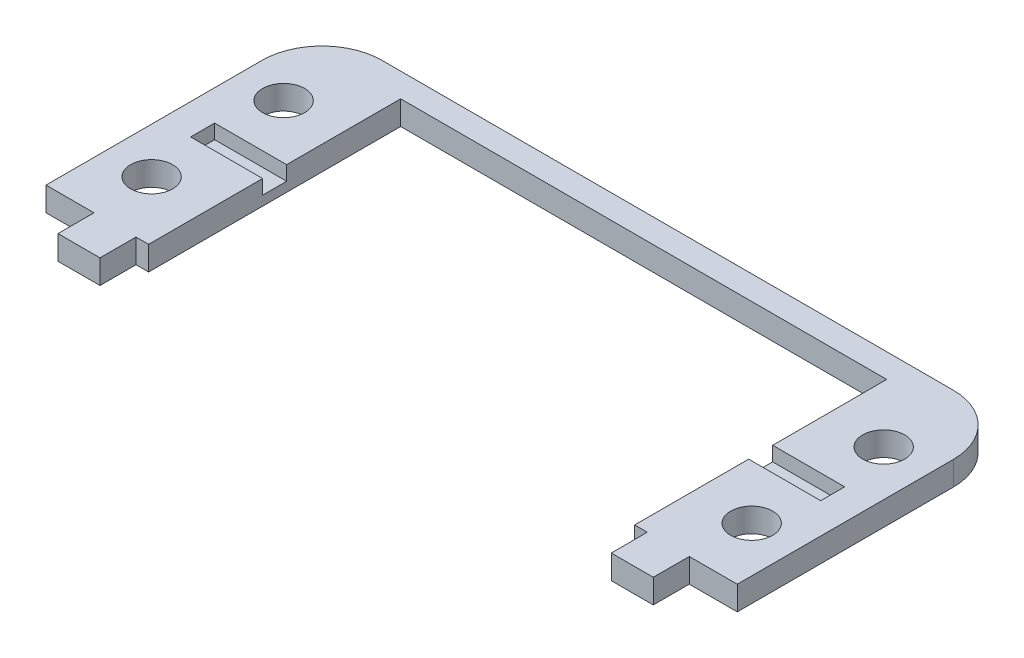
ISO-10303-21;
HEADER;
FILE_DESCRIPTION(('STEP AP214'),'2;1');
FILE_NAME('part.step','',(''),(''),'','','');
FILE_SCHEMA(('AUTOMOTIVE_DESIGN { 1 0 10303 214 1 1 1 1 }'));
ENDSEC;
DATA;
#1=APPLICATION_CONTEXT('core data for automotive mechanical design processes');
#2=APPLICATION_PROTOCOL_DEFINITION('international standard','automotive_design',2000,#1);
#3=PRODUCT_CONTEXT('',#1,'mechanical');
#4=PRODUCT('Part','Part','',(#3));
#5=PRODUCT_RELATED_PRODUCT_CATEGORY('part','',(#4));
#6=PRODUCT_DEFINITION_FORMATION('','',#4);
#7=PRODUCT_DEFINITION_CONTEXT('part definition',#1,'design');
#8=PRODUCT_DEFINITION('design','',#6,#7);
#9=PRODUCT_DEFINITION_SHAPE('','',#8);
#10=(LENGTH_UNIT() NAMED_UNIT(*) SI_UNIT(.MILLI.,.METRE.));
#11=(NAMED_UNIT(*) PLANE_ANGLE_UNIT() SI_UNIT($,.RADIAN.));
#12=(NAMED_UNIT(*) SI_UNIT($,.STERADIAN.) SOLID_ANGLE_UNIT());
#13=UNCERTAINTY_MEASURE_WITH_UNIT(LENGTH_MEASURE(1.E-05),#10,'distance_accuracy_value','');
#14=(GEOMETRIC_REPRESENTATION_CONTEXT(3) GLOBAL_UNCERTAINTY_ASSIGNED_CONTEXT((#13)) GLOBAL_UNIT_ASSIGNED_CONTEXT((#10,
#11,#12)) REPRESENTATION_CONTEXT('',''));
#15=CARTESIAN_POINT('',(0.,0.,0.));
#16=DIRECTION('',(0.,0.,1.));
#17=DIRECTION('',(1.,0.,0.));
#18=AXIS2_PLACEMENT_3D('',#15,#16,#17);
#19=CARTESIAN_POINT('',(28.8,2.,0.));
#20=DIRECTION('',(1.,0.,0.));
#21=DIRECTION('',(0.,0.,-1.));
#22=AXIS2_PLACEMENT_3D('',#19,#20,#21);
#23=PLANE('',#22);
#24=DIRECTION('',(0.,0.,1.));
#25=VECTOR('',#24,1.);
#26=CARTESIAN_POINT('',(28.8,0.,0.));
#27=LINE('',#26,#25);
#28=CARTESIAN_POINT('',(28.8,0.,-18.));
#29=VERTEX_POINT('',#28);
#30=CARTESIAN_POINT('',(28.8,0.,0.));
#31=VERTEX_POINT('',#30);
#32=EDGE_CURVE('E263',#29,#31,#27,.T.);
#33=ORIENTED_EDGE('',*,*,#32,.F.);
#34=DIRECTION('',(0.,-1.,0.));
#35=VECTOR('',#34,1.);
#36=CARTESIAN_POINT('',(28.8,2.,-18.));
#37=LINE('',#36,#35);
#38=CARTESIAN_POINT('',(28.8,2.,-18.));
#39=VERTEX_POINT('',#38);
#40=EDGE_CURVE('E11',#39,#29,#37,.T.);
#41=ORIENTED_EDGE('',*,*,#40,.F.);
#42=DIRECTION('',(0.,0.,1.));
#43=VECTOR('',#42,1.);
#44=CARTESIAN_POINT('',(28.8,2.,0.));
#45=LINE('',#44,#43);
#46=CARTESIAN_POINT('',(28.8,2.,0.));
#47=VERTEX_POINT('',#46);
#48=EDGE_CURVE('E269',#39,#47,#45,.T.);
#49=ORIENTED_EDGE('',*,*,#48,.T.);
#50=DIRECTION('',(0.,-1.,0.));
#51=VECTOR('',#50,1.);
#52=CARTESIAN_POINT('',(28.8,2.,0.));
#53=LINE('',#52,#51);
#54=EDGE_CURVE('E331',#47,#31,#53,.T.);
#55=ORIENTED_EDGE('',*,*,#54,.T.);
#56=EDGE_LOOP('',(#33,#41,#49,#55));
#57=FACE_BOUND('',#56,.T.);
#58=ADVANCED_FACE('F34',(#57),#23,.T.);
#59=CARTESIAN_POINT('',(23.8,2.,-18.));
#60=DIRECTION('',(0.,-1.,0.));
#61=DIRECTION('',(0.,0.,-1.));
#62=AXIS2_PLACEMENT_3D('',#59,#60,#61);
#63=CYLINDRICAL_SURFACE('',#62,5.);
#64=CARTESIAN_POINT('',(23.8,0.,-18.));
#65=DIRECTION('',(0.,1.,0.));
#66=DIRECTION('',(0.,0.,1.));
#67=AXIS2_PLACEMENT_3D('',#64,#65,#66);
#68=CIRCLE('',#67,5.);
#69=CARTESIAN_POINT('',(23.8,0.,-23.));
#70=VERTEX_POINT('',#69);
#71=EDGE_CURVE('E334',#29,#70,#68,.T.);
#72=ORIENTED_EDGE('',*,*,#71,.T.);
#73=DIRECTION('',(0.,-1.,0.));
#74=VECTOR('',#73,1.);
#75=CARTESIAN_POINT('',(23.8,2.,-23.));
#76=LINE('',#75,#74);
#77=CARTESIAN_POINT('',(23.8,2.,-23.));
#78=VERTEX_POINT('',#77);
#79=EDGE_CURVE('E41',#78,#70,#76,.T.);
#80=ORIENTED_EDGE('',*,*,#79,.F.);
#81=CARTESIAN_POINT('',(23.8,2.,-18.));
#82=DIRECTION('',(0.,1.,0.));
#83=DIRECTION('',(0.,0.,1.));
#84=AXIS2_PLACEMENT_3D('',#81,#82,#83);
#85=CIRCLE('',#84,5.);
#86=EDGE_CURVE('E272',#39,#78,#85,.T.);
#87=ORIENTED_EDGE('',*,*,#86,.F.);
#88=ORIENTED_EDGE('',*,*,#40,.T.);
#89=EDGE_LOOP('',(#72,#80,#87,#88));
#90=FACE_BOUND('',#89,.T.);
#91=ADVANCED_FACE('F434',(#90),#63,.T.);
#92=CARTESIAN_POINT('',(0.,2.,-23.));
#93=DIRECTION('',(0.,0.,-1.));
#94=DIRECTION('',(-1.,0.,0.));
#95=AXIS2_PLACEMENT_3D('',#92,#93,#94);
#96=PLANE('',#95);
#97=DIRECTION('',(1.,0.,0.));
#98=VECTOR('',#97,1.);
#99=CARTESIAN_POINT('',(0.,0.,-23.));
#100=LINE('',#99,#98);
#101=CARTESIAN_POINT('',(-23.8,0.,-23.));
#102=VERTEX_POINT('',#101);
#103=EDGE_CURVE('E337',#102,#70,#100,.T.);
#104=ORIENTED_EDGE('',*,*,#103,.F.);
#105=DIRECTION('',(0.,-1.,0.));
#106=VECTOR('',#105,1.);
#107=CARTESIAN_POINT('',(-23.8,2.,-23.));
#108=LINE('',#107,#106);
#109=CARTESIAN_POINT('',(-23.8,2.,-23.));
#110=VERTEX_POINT('',#109);
#111=EDGE_CURVE('E425',#110,#102,#108,.T.);
#112=ORIENTED_EDGE('',*,*,#111,.F.);
#113=DIRECTION('',(1.,0.,0.));
#114=VECTOR('',#113,1.);
#115=CARTESIAN_POINT('',(0.,2.,-23.));
#116=LINE('',#115,#114);
#117=EDGE_CURVE('E275',#110,#78,#116,.T.);
#118=ORIENTED_EDGE('',*,*,#117,.T.);
#119=ORIENTED_EDGE('',*,*,#79,.T.);
#120=EDGE_LOOP('',(#104,#112,#118,#119));
#121=FACE_BOUND('',#120,.T.);
#122=ADVANCED_FACE('F429',(#121),#96,.T.);
#123=CARTESIAN_POINT('',(-23.8,2.,-18.));
#124=DIRECTION('',(0.,-1.,0.));
#125=DIRECTION('',(0.,0.,-1.));
#126=AXIS2_PLACEMENT_3D('',#123,#124,#125);
#127=CYLINDRICAL_SURFACE('',#126,5.);
#128=CARTESIAN_POINT('',(-23.8,0.,-18.));
#129=DIRECTION('',(0.,1.,0.));
#130=DIRECTION('',(0.,0.,1.));
#131=AXIS2_PLACEMENT_3D('',#128,#129,#130);
#132=CIRCLE('',#131,5.);
#133=CARTESIAN_POINT('',(-28.8,0.,-18.));
#134=VERTEX_POINT('',#133);
#135=EDGE_CURVE('E340',#134,#102,#132,.F.);
#136=ORIENTED_EDGE('',*,*,#135,.F.);
#137=DIRECTION('',(0.,-1.,0.));
#138=VECTOR('',#137,1.);
#139=CARTESIAN_POINT('',(-28.8,2.,-18.));
#140=LINE('',#139,#138);
#141=CARTESIAN_POINT('',(-28.8,2.,-18.));
#142=VERTEX_POINT('',#141);
#143=EDGE_CURVE('E423',#142,#134,#140,.T.);
#144=ORIENTED_EDGE('',*,*,#143,.F.);
#145=CARTESIAN_POINT('',(-23.8,2.,-18.));
#146=DIRECTION('',(0.,1.,0.));
#147=DIRECTION('',(0.,0.,1.));
#148=AXIS2_PLACEMENT_3D('',#145,#146,#147);
#149=CIRCLE('',#148,5.);
#150=EDGE_CURVE('E278',#142,#110,#149,.F.);
#151=ORIENTED_EDGE('',*,*,#150,.T.);
#152=ORIENTED_EDGE('',*,*,#111,.T.);
#153=EDGE_LOOP('',(#136,#144,#151,#152));
#154=FACE_BOUND('',#153,.T.);
#155=ADVANCED_FACE('F443',(#154),#127,.T.);
#156=CARTESIAN_POINT('',(-28.8,2.,0.));
#157=DIRECTION('',(-1.,0.,0.));
#158=DIRECTION('',(0.,0.,1.));
#159=AXIS2_PLACEMENT_3D('',#156,#157,#158);
#160=PLANE('',#159);
#161=DIRECTION('',(0.,0.,-1.));
#162=VECTOR('',#161,1.);
#163=CARTESIAN_POINT('',(-28.8,0.,0.));
#164=LINE('',#163,#162);
#165=CARTESIAN_POINT('',(-28.8,0.,0.));
#166=VERTEX_POINT('',#165);
#167=EDGE_CURVE('E343',#166,#134,#164,.T.);
#168=ORIENTED_EDGE('',*,*,#167,.F.);
#169=DIRECTION('',(0.,-1.,0.));
#170=VECTOR('',#169,1.);
#171=CARTESIAN_POINT('',(-28.8,2.,0.));
#172=LINE('',#171,#170);
#173=CARTESIAN_POINT('',(-28.8,2.,0.));
#174=VERTEX_POINT('',#173);
#175=EDGE_CURVE('E421',#174,#166,#172,.T.);
#176=ORIENTED_EDGE('',*,*,#175,.F.);
#177=DIRECTION('',(0.,0.,-1.));
#178=VECTOR('',#177,1.);
#179=CARTESIAN_POINT('',(-28.8,2.,0.));
#180=LINE('',#179,#178);
#181=EDGE_CURVE('E281',#174,#142,#180,.T.);
#182=ORIENTED_EDGE('',*,*,#181,.T.);
#183=ORIENTED_EDGE('',*,*,#143,.T.);
#184=EDGE_LOOP('',(#168,#176,#182,#183));
#185=FACE_BOUND('',#184,.T.);
#186=ADVANCED_FACE('F514',(#185),#160,.T.);
#187=CARTESIAN_POINT('',(0.,2.,0.));
#188=DIRECTION('',(0.,0.,-1.));
#189=DIRECTION('',(-1.,0.,0.));
#190=AXIS2_PLACEMENT_3D('',#187,#188,#189);
#191=PLANE('',#190);
#192=DIRECTION('',(1.,0.,0.));
#193=VECTOR('',#192,1.);
#194=CARTESIAN_POINT('',(0.,0.,0.));
#195=LINE('',#194,#193);
#196=CARTESIAN_POINT('',(-24.8,0.,0.));
#197=VERTEX_POINT('',#196);
#198=EDGE_CURVE('E346',#166,#197,#195,.T.);
#199=ORIENTED_EDGE('',*,*,#198,.T.);
#200=DIRECTION('',(0.,-1.,0.));
#201=VECTOR('',#200,1.);
#202=CARTESIAN_POINT('',(-24.8,2.,0.));
#203=LINE('',#202,#201);
#204=CARTESIAN_POINT('',(-24.8,2.,0.));
#205=VERTEX_POINT('',#204);
#206=EDGE_CURVE('E418',#205,#197,#203,.T.);
#207=ORIENTED_EDGE('',*,*,#206,.F.);
#208=DIRECTION('',(1.,0.,0.));
#209=VECTOR('',#208,1.);
#210=CARTESIAN_POINT('',(0.,2.,0.));
#211=LINE('',#210,#209);
#212=EDGE_CURVE('E284',#174,#205,#211,.T.);
#213=ORIENTED_EDGE('',*,*,#212,.F.);
#214=ORIENTED_EDGE('',*,*,#175,.T.);
#215=EDGE_LOOP('',(#199,#207,#213,#214));
#216=FACE_BOUND('',#215,.T.);
#217=ADVANCED_FACE('F512',(#216),#191,.F.);
#218=CARTESIAN_POINT('',(-24.8,2.,0.));
#219=DIRECTION('',(1.,0.,0.));
#220=DIRECTION('',(0.,0.,-1.));
#221=AXIS2_PLACEMENT_3D('',#218,#219,#220);
#222=PLANE('',#221);
#223=DIRECTION('',(0.,0.,1.));
#224=VECTOR('',#223,1.);
#225=CARTESIAN_POINT('',(-24.8,0.,0.));
#226=LINE('',#225,#224);
#227=CARTESIAN_POINT('',(-24.8,0.,3.));
#228=VERTEX_POINT('',#227);
#229=EDGE_CURVE('E348',#197,#228,#226,.T.);
#230=ORIENTED_EDGE('',*,*,#229,.T.);
#231=DIRECTION('',(0.,-1.,0.));
#232=VECTOR('',#231,1.);
#233=CARTESIAN_POINT('',(-24.8,2.,3.));
#234=LINE('',#233,#232);
#235=CARTESIAN_POINT('',(-24.8,2.,3.));
#236=VERTEX_POINT('',#235);
#237=EDGE_CURVE('E415',#236,#228,#234,.T.);
#238=ORIENTED_EDGE('',*,*,#237,.F.);
#239=DIRECTION('',(0.,0.,1.));
#240=VECTOR('',#239,1.);
#241=CARTESIAN_POINT('',(-24.8,2.,0.));
#242=LINE('',#241,#240);
#243=EDGE_CURVE('E286',#205,#236,#242,.T.);
#244=ORIENTED_EDGE('',*,*,#243,.F.);
#245=ORIENTED_EDGE('',*,*,#206,.T.);
#246=EDGE_LOOP('',(#230,#238,#244,#245));
#247=FACE_BOUND('',#246,.T.);
#248=ADVANCED_FACE('F507',(#247),#222,.F.);
#249=CARTESIAN_POINT('',(0.,2.,3.));
#250=DIRECTION('',(0.,0.,-1.));
#251=DIRECTION('',(-1.,0.,0.));
#252=AXIS2_PLACEMENT_3D('',#249,#250,#251);
#253=PLANE('',#252);
#254=DIRECTION('',(1.,0.,0.));
#255=VECTOR('',#254,1.);
#256=CARTESIAN_POINT('',(0.,0.,3.));
#257=LINE('',#256,#255);
#258=CARTESIAN_POINT('',(-21.3,0.,3.));
#259=VERTEX_POINT('',#258);
#260=EDGE_CURVE('E350',#228,#259,#257,.T.);
#261=ORIENTED_EDGE('',*,*,#260,.T.);
#262=DIRECTION('',(0.,-1.,0.));
#263=VECTOR('',#262,1.);
#264=CARTESIAN_POINT('',(-21.3,2.,3.));
#265=LINE('',#264,#263);
#266=CARTESIAN_POINT('',(-21.3,2.,3.));
#267=VERTEX_POINT('',#266);
#268=EDGE_CURVE('E412',#267,#259,#265,.T.);
#269=ORIENTED_EDGE('',*,*,#268,.F.);
#270=DIRECTION('',(1.,0.,0.));
#271=VECTOR('',#270,1.);
#272=CARTESIAN_POINT('',(0.,2.,3.));
#273=LINE('',#272,#271);
#274=EDGE_CURVE('E288',#236,#267,#273,.T.);
#275=ORIENTED_EDGE('',*,*,#274,.F.);
#276=ORIENTED_EDGE('',*,*,#237,.T.);
#277=EDGE_LOOP('',(#261,#269,#275,#276));
#278=FACE_BOUND('',#277,.T.);
#279=ADVANCED_FACE('F503',(#278),#253,.F.);
#280=CARTESIAN_POINT('',(-21.3,2.,0.));
#281=DIRECTION('',(-1.,0.,0.));
#282=DIRECTION('',(0.,0.,1.));
#283=AXIS2_PLACEMENT_3D('',#280,#281,#282);
#284=PLANE('',#283);
#285=DIRECTION('',(0.,0.,-1.));
#286=VECTOR('',#285,1.);
#287=CARTESIAN_POINT('',(-21.3,0.,0.));
#288=LINE('',#287,#286);
#289=CARTESIAN_POINT('',(-21.3,0.,0.));
#290=VERTEX_POINT('',#289);
#291=EDGE_CURVE('E352',#259,#290,#288,.T.);
#292=ORIENTED_EDGE('',*,*,#291,.T.);
#293=DIRECTION('',(0.,-1.,0.));
#294=VECTOR('',#293,1.);
#295=CARTESIAN_POINT('',(-21.3,2.,0.));
#296=LINE('',#295,#294);
#297=CARTESIAN_POINT('',(-21.3,2.,0.));
#298=VERTEX_POINT('',#297);
#299=EDGE_CURVE('E409',#298,#290,#296,.T.);
#300=ORIENTED_EDGE('',*,*,#299,.F.);
#301=DIRECTION('',(0.,0.,-1.));
#302=VECTOR('',#301,1.);
#303=CARTESIAN_POINT('',(-21.3,2.,0.));
#304=LINE('',#303,#302);
#305=EDGE_CURVE('E290',#267,#298,#304,.T.);
#306=ORIENTED_EDGE('',*,*,#305,.F.);
#307=ORIENTED_EDGE('',*,*,#268,.T.);
#308=EDGE_LOOP('',(#292,#300,#306,#307));
#309=FACE_BOUND('',#308,.T.);
#310=ADVANCED_FACE('F499',(#309),#284,.F.);
#311=CARTESIAN_POINT('',(0.,2.,0.));
#312=DIRECTION('',(0.,0.,-1.));
#313=DIRECTION('',(-1.,0.,0.));
#314=AXIS2_PLACEMENT_3D('',#311,#312,#313);
#315=PLANE('',#314);
#316=DIRECTION('',(1.,0.,0.));
#317=VECTOR('',#316,1.);
#318=CARTESIAN_POINT('',(0.,0.,0.));
#319=LINE('',#318,#317);
#320=CARTESIAN_POINT('',(-20.25,0.,0.));
#321=VERTEX_POINT('',#320);
#322=EDGE_CURVE('E354',#290,#321,#319,.T.);
#323=ORIENTED_EDGE('',*,*,#322,.T.);
#324=DIRECTION('',(0.,-1.,0.));
#325=VECTOR('',#324,1.);
#326=CARTESIAN_POINT('',(-20.25,2.,0.));
#327=LINE('',#326,#325);
#328=CARTESIAN_POINT('',(-20.25,2.,0.));
#329=VERTEX_POINT('',#328);
#330=EDGE_CURVE('E406',#329,#321,#327,.T.);
#331=ORIENTED_EDGE('',*,*,#330,.F.);
#332=DIRECTION('',(1.,0.,0.));
#333=VECTOR('',#332,1.);
#334=CARTESIAN_POINT('',(0.,2.,0.));
#335=LINE('',#334,#333);
#336=EDGE_CURVE('E292',#298,#329,#335,.T.);
#337=ORIENTED_EDGE('',*,*,#336,.F.);
#338=ORIENTED_EDGE('',*,*,#299,.T.);
#339=EDGE_LOOP('',(#323,#331,#337,#338));
#340=FACE_BOUND('',#339,.T.);
#341=ADVANCED_FACE('F494',(#340),#315,.F.);
#342=CARTESIAN_POINT('',(-20.25,2.,0.));
#343=DIRECTION('',(-1.,0.,0.));
#344=DIRECTION('',(0.,0.,1.));
#345=AXIS2_PLACEMENT_3D('',#342,#343,#344);
#346=PLANE('',#345);
#347=DIRECTION('',(0.,0.,-1.));
#348=VECTOR('',#347,1.);
#349=CARTESIAN_POINT('',(-20.25,0.8,-9.5));
#350=LINE('',#349,#348);
#351=CARTESIAN_POINT('',(-20.25,0.8,-9.5));
#352=VERTEX_POINT('',#351);
#353=CARTESIAN_POINT('',(-20.25,0.8,-11.5));
#354=VERTEX_POINT('',#353);
#355=EDGE_CURVE('E242',#352,#354,#350,.T.);
#356=ORIENTED_EDGE('',*,*,#355,.F.);
#357=DIRECTION('',(0.,1.,0.));
#358=VECTOR('',#357,1.);
#359=CARTESIAN_POINT('',(-20.25,0.8,-9.5));
#360=LINE('',#359,#358);
#361=CARTESIAN_POINT('',(-20.25,2.,-9.5));
#362=VERTEX_POINT('',#361);
#363=EDGE_CURVE('E260',#352,#362,#360,.T.);
#364=ORIENTED_EDGE('',*,*,#363,.T.);
#365=DIRECTION('',(0.,0.,-1.));
#366=VECTOR('',#365,1.);
#367=CARTESIAN_POINT('',(-20.25,2.,0.));
#368=LINE('',#367,#366);
#369=EDGE_CURVE('E295',#329,#362,#368,.T.);
#370=ORIENTED_EDGE('',*,*,#369,.F.);
#371=ORIENTED_EDGE('',*,*,#330,.T.);
#372=DIRECTION('',(0.,0.,-1.));
#373=VECTOR('',#372,1.);
#374=CARTESIAN_POINT('',(-20.25,0.,0.));
#375=LINE('',#374,#373);
#376=CARTESIAN_POINT('',(-20.25,0.,-21.));
#377=VERTEX_POINT('',#376);
#378=EDGE_CURVE('E356',#321,#377,#375,.T.);
#379=ORIENTED_EDGE('',*,*,#378,.T.);
#380=DIRECTION('',(0.,-1.,0.));
#381=VECTOR('',#380,1.);
#382=CARTESIAN_POINT('',(-20.25,2.,-21.));
#383=LINE('',#382,#381);
#384=CARTESIAN_POINT('',(-20.25,2.,-21.));
#385=VERTEX_POINT('',#384);
#386=EDGE_CURVE('E403',#385,#377,#383,.T.);
#387=ORIENTED_EDGE('',*,*,#386,.F.);
#388=CARTESIAN_POINT('',(-20.25,2.,-11.5));
#389=VERTEX_POINT('',#388);
#390=EDGE_CURVE('E294',#389,#385,#368,.T.);
#391=ORIENTED_EDGE('',*,*,#390,.F.);
#392=DIRECTION('',(0.,1.,0.));
#393=VECTOR('',#392,1.);
#394=CARTESIAN_POINT('',(-20.25,0.8,-11.5));
#395=LINE('',#394,#393);
#396=EDGE_CURVE('E56',#354,#389,#395,.T.);
#397=ORIENTED_EDGE('',*,*,#396,.F.);
#398=EDGE_LOOP('',(#356,#364,#370,#371,#379,#387,#391,#397));
#399=FACE_BOUND('',#398,.T.);
#400=ADVANCED_FACE('F487',(#399),#346,.F.);
#401=CARTESIAN_POINT('',(0.,2.,-21.));
#402=DIRECTION('',(0.,0.,-1.));
#403=DIRECTION('',(-1.,0.,0.));
#404=AXIS2_PLACEMENT_3D('',#401,#402,#403);
#405=PLANE('',#404);
#406=DIRECTION('',(1.,0.,0.));
#407=VECTOR('',#406,1.);
#408=CARTESIAN_POINT('',(0.,0.,-21.));
#409=LINE('',#408,#407);
#410=CARTESIAN_POINT('',(20.25,0.,-21.));
#411=VERTEX_POINT('',#410);
#412=EDGE_CURVE('E358',#377,#411,#409,.T.);
#413=ORIENTED_EDGE('',*,*,#412,.T.);
#414=DIRECTION('',(0.,-1.,0.));
#415=VECTOR('',#414,1.);
#416=CARTESIAN_POINT('',(20.25,2.,-21.));
#417=LINE('',#416,#415);
#418=CARTESIAN_POINT('',(20.25,2.,-21.));
#419=VERTEX_POINT('',#418);
#420=EDGE_CURVE('E400',#419,#411,#417,.T.);
#421=ORIENTED_EDGE('',*,*,#420,.F.);
#422=DIRECTION('',(1.,0.,0.));
#423=VECTOR('',#422,1.);
#424=CARTESIAN_POINT('',(0.,2.,-21.));
#425=LINE('',#424,#423);
#426=EDGE_CURVE('E298',#385,#419,#425,.T.);
#427=ORIENTED_EDGE('',*,*,#426,.F.);
#428=ORIENTED_EDGE('',*,*,#386,.T.);
#429=EDGE_LOOP('',(#413,#421,#427,#428));
#430=FACE_BOUND('',#429,.T.);
#431=ADVANCED_FACE('F482',(#430),#405,.F.);
#432=CARTESIAN_POINT('',(20.25,2.,0.));
#433=DIRECTION('',(1.,0.,0.));
#434=DIRECTION('',(0.,0.,-1.));
#435=AXIS2_PLACEMENT_3D('',#432,#433,#434);
#436=PLANE('',#435);
#437=DIRECTION('',(0.,0.,1.));
#438=VECTOR('',#437,1.);
#439=CARTESIAN_POINT('',(20.25,2.,0.));
#440=LINE('',#439,#438);
#441=CARTESIAN_POINT('',(20.25,2.,-9.5));
#442=VERTEX_POINT('',#441);
#443=CARTESIAN_POINT('',(20.25,2.,0.));
#444=VERTEX_POINT('',#443);
#445=EDGE_CURVE('E300',#442,#444,#440,.T.);
#446=ORIENTED_EDGE('',*,*,#445,.F.);
#447=DIRECTION('',(0.,1.,0.));
#448=VECTOR('',#447,1.);
#449=CARTESIAN_POINT('',(20.25,0.8,-9.5));
#450=LINE('',#449,#448);
#451=CARTESIAN_POINT('',(20.25,0.8,-9.5));
#452=VERTEX_POINT('',#451);
#453=EDGE_CURVE('E235',#452,#442,#450,.T.);
#454=ORIENTED_EDGE('',*,*,#453,.F.);
#455=DIRECTION('',(0.,0.,1.));
#456=VECTOR('',#455,1.);
#457=CARTESIAN_POINT('',(20.25,0.8,-9.5));
#458=LINE('',#457,#456);
#459=CARTESIAN_POINT('',(20.25,0.8,-11.5));
#460=VERTEX_POINT('',#459);
#461=EDGE_CURVE('E213',#460,#452,#458,.T.);
#462=ORIENTED_EDGE('',*,*,#461,.F.);
#463=DIRECTION('',(0.,1.,0.));
#464=VECTOR('',#463,1.);
#465=CARTESIAN_POINT('',(20.25,0.8,-11.5));
#466=LINE('',#465,#464);
#467=CARTESIAN_POINT('',(20.25,2.,-11.5));
#468=VERTEX_POINT('',#467);
#469=EDGE_CURVE('E238',#460,#468,#466,.T.);
#470=ORIENTED_EDGE('',*,*,#469,.T.);
#471=EDGE_CURVE('E301',#419,#468,#440,.T.);
#472=ORIENTED_EDGE('',*,*,#471,.F.);
#473=ORIENTED_EDGE('',*,*,#420,.T.);
#474=DIRECTION('',(0.,0.,1.));
#475=VECTOR('',#474,1.);
#476=CARTESIAN_POINT('',(20.25,0.,0.));
#477=LINE('',#476,#475);
#478=CARTESIAN_POINT('',(20.25,0.,0.));
#479=VERTEX_POINT('',#478);
#480=EDGE_CURVE('E360',#411,#479,#477,.T.);
#481=ORIENTED_EDGE('',*,*,#480,.T.);
#482=DIRECTION('',(0.,-1.,0.));
#483=VECTOR('',#482,1.);
#484=CARTESIAN_POINT('',(20.25,2.,0.));
#485=LINE('',#484,#483);
#486=EDGE_CURVE('E398',#444,#479,#485,.T.);
#487=ORIENTED_EDGE('',*,*,#486,.F.);
#488=EDGE_LOOP('',(#446,#454,#462,#470,#472,#473,#481,#487));
#489=FACE_BOUND('',#488,.T.);
#490=ADVANCED_FACE('F477',(#489),#436,.F.);
#491=CARTESIAN_POINT('',(0.,2.,0.));
#492=DIRECTION('',(0.,0.,1.));
#493=DIRECTION('',(1.,0.,0.));
#494=AXIS2_PLACEMENT_3D('',#491,#492,#493);
#495=PLANE('',#494);
#496=DIRECTION('',(-1.,0.,0.));
#497=VECTOR('',#496,1.);
#498=CARTESIAN_POINT('',(0.,0.,0.));
#499=LINE('',#498,#497);
#500=CARTESIAN_POINT('',(21.3,0.,0.));
#501=VERTEX_POINT('',#500);
#502=EDGE_CURVE('E363',#501,#479,#499,.T.);
#503=ORIENTED_EDGE('',*,*,#502,.F.);
#504=DIRECTION('',(0.,-1.,0.));
#505=VECTOR('',#504,1.);
#506=CARTESIAN_POINT('',(21.3,2.,0.));
#507=LINE('',#506,#505);
#508=CARTESIAN_POINT('',(21.3,2.,0.));
#509=VERTEX_POINT('',#508);
#510=EDGE_CURVE('E396',#509,#501,#507,.T.);
#511=ORIENTED_EDGE('',*,*,#510,.F.);
#512=DIRECTION('',(-1.,0.,0.));
#513=VECTOR('',#512,1.);
#514=CARTESIAN_POINT('',(0.,2.,0.));
#515=LINE('',#514,#513);
#516=EDGE_CURVE('E304',#509,#444,#515,.T.);
#517=ORIENTED_EDGE('',*,*,#516,.T.);
#518=ORIENTED_EDGE('',*,*,#486,.T.);
#519=EDGE_LOOP('',(#503,#511,#517,#518));
#520=FACE_BOUND('',#519,.T.);
#521=ADVANCED_FACE('F470',(#520),#495,.T.);
#522=CARTESIAN_POINT('',(21.3,2.,0.));
#523=DIRECTION('',(-1.,0.,0.));
#524=DIRECTION('',(0.,0.,1.));
#525=AXIS2_PLACEMENT_3D('',#522,#523,#524);
#526=PLANE('',#525);
#527=DIRECTION('',(0.,0.,-1.));
#528=VECTOR('',#527,1.);
#529=CARTESIAN_POINT('',(21.3,0.,0.));
#530=LINE('',#529,#528);
#531=CARTESIAN_POINT('',(21.3,0.,3.));
#532=VERTEX_POINT('',#531);
#533=EDGE_CURVE('E366',#532,#501,#530,.T.);
#534=ORIENTED_EDGE('',*,*,#533,.F.);
#535=DIRECTION('',(0.,-1.,0.));
#536=VECTOR('',#535,1.);
#537=CARTESIAN_POINT('',(21.3,2.,3.));
#538=LINE('',#537,#536);
#539=CARTESIAN_POINT('',(21.3,2.,3.));
#540=VERTEX_POINT('',#539);
#541=EDGE_CURVE('E394',#540,#532,#538,.T.);
#542=ORIENTED_EDGE('',*,*,#541,.F.);
#543=DIRECTION('',(0.,0.,-1.));
#544=VECTOR('',#543,1.);
#545=CARTESIAN_POINT('',(21.3,2.,0.));
#546=LINE('',#545,#544);
#547=EDGE_CURVE('E307',#540,#509,#546,.T.);
#548=ORIENTED_EDGE('',*,*,#547,.T.);
#549=ORIENTED_EDGE('',*,*,#510,.T.);
#550=EDGE_LOOP('',(#534,#542,#548,#549));
#551=FACE_BOUND('',#550,.T.);
#552=ADVANCED_FACE('F466',(#551),#526,.T.);
#553=CARTESIAN_POINT('',(0.,2.,3.));
#554=DIRECTION('',(0.,0.,1.));
#555=DIRECTION('',(1.,0.,0.));
#556=AXIS2_PLACEMENT_3D('',#553,#554,#555);
#557=PLANE('',#556);
#558=DIRECTION('',(-1.,0.,0.));
#559=VECTOR('',#558,1.);
#560=CARTESIAN_POINT('',(0.,0.,3.));
#561=LINE('',#560,#559);
#562=CARTESIAN_POINT('',(24.8,0.,3.));
#563=VERTEX_POINT('',#562);
#564=EDGE_CURVE('E369',#563,#532,#561,.T.);
#565=ORIENTED_EDGE('',*,*,#564,.F.);
#566=DIRECTION('',(0.,-1.,0.));
#567=VECTOR('',#566,1.);
#568=CARTESIAN_POINT('',(24.8,2.,3.));
#569=LINE('',#568,#567);
#570=CARTESIAN_POINT('',(24.8,2.,3.));
#571=VERTEX_POINT('',#570);
#572=EDGE_CURVE('E392',#571,#563,#569,.T.);
#573=ORIENTED_EDGE('',*,*,#572,.F.);
#574=DIRECTION('',(-1.,0.,0.));
#575=VECTOR('',#574,1.);
#576=CARTESIAN_POINT('',(0.,2.,3.));
#577=LINE('',#576,#575);
#578=EDGE_CURVE('E310',#571,#540,#577,.T.);
#579=ORIENTED_EDGE('',*,*,#578,.T.);
#580=ORIENTED_EDGE('',*,*,#541,.T.);
#581=EDGE_LOOP('',(#565,#573,#579,#580));
#582=FACE_BOUND('',#581,.T.);
#583=ADVANCED_FACE('F462',(#582),#557,.T.);
#584=CARTESIAN_POINT('',(24.8,2.,0.));
#585=DIRECTION('',(1.,0.,0.));
#586=DIRECTION('',(0.,0.,-1.));
#587=AXIS2_PLACEMENT_3D('',#584,#585,#586);
#588=PLANE('',#587);
#589=DIRECTION('',(0.,0.,1.));
#590=VECTOR('',#589,1.);
#591=CARTESIAN_POINT('',(24.8,0.,0.));
#592=LINE('',#591,#590);
#593=CARTESIAN_POINT('',(24.8,0.,0.));
#594=VERTEX_POINT('',#593);
#595=EDGE_CURVE('E372',#594,#563,#592,.T.);
#596=ORIENTED_EDGE('',*,*,#595,.F.);
#597=DIRECTION('',(0.,-1.,0.));
#598=VECTOR('',#597,1.);
#599=CARTESIAN_POINT('',(24.8,2.,0.));
#600=LINE('',#599,#598);
#601=CARTESIAN_POINT('',(24.8,2.,0.));
#602=VERTEX_POINT('',#601);
#603=EDGE_CURVE('E390',#602,#594,#600,.T.);
#604=ORIENTED_EDGE('',*,*,#603,.F.);
#605=DIRECTION('',(0.,0.,1.));
#606=VECTOR('',#605,1.);
#607=CARTESIAN_POINT('',(24.8,2.,0.));
#608=LINE('',#607,#606);
#609=EDGE_CURVE('E313',#602,#571,#608,.T.);
#610=ORIENTED_EDGE('',*,*,#609,.T.);
#611=ORIENTED_EDGE('',*,*,#572,.T.);
#612=EDGE_LOOP('',(#596,#604,#610,#611));
#613=FACE_BOUND('',#612,.T.);
#614=ADVANCED_FACE('F458',(#613),#588,.T.);
#615=CARTESIAN_POINT('',(25.,2.,-16.));
#616=DIRECTION('',(0.,-1.,0.));
#617=DIRECTION('',(0.,0.,-1.));
#618=AXIS2_PLACEMENT_3D('',#615,#616,#617);
#619=CYLINDRICAL_SURFACE('',#618,1.75);
#620=CARTESIAN_POINT('',(25.,2.,-16.));
#621=DIRECTION('',(0.,1.,0.));
#622=DIRECTION('',(0.,0.,1.));
#623=AXIS2_PLACEMENT_3D('',#620,#621,#622);
#624=CIRCLE('',#623,1.75);
#625=CARTESIAN_POINT('',(25.,2.,-14.25));
#626=VERTEX_POINT('',#625);
#627=EDGE_CURVE('E325',#626,#626,#624,.T.);
#628=ORIENTED_EDGE('',*,*,#627,.T.);
#629=EDGE_LOOP('',(#628));
#630=FACE_BOUND('',#629,.T.);
#631=CARTESIAN_POINT('',(25.,0.,-16.));
#632=DIRECTION('',(0.,1.,0.));
#633=DIRECTION('',(0.,0.,1.));
#634=AXIS2_PLACEMENT_3D('',#631,#632,#633);
#635=CIRCLE('',#634,1.75);
#636=CARTESIAN_POINT('',(25.,0.,-14.25));
#637=VERTEX_POINT('',#636);
#638=EDGE_CURVE('E384',#637,#637,#635,.T.);
#639=ORIENTED_EDGE('',*,*,#638,.F.);
#640=EDGE_LOOP('',(#639));
#641=FACE_BOUND('',#640,.T.);
#642=ADVANCED_FACE('F572',(#630,#641),#619,.F.);
#643=CARTESIAN_POINT('',(25.,2.,-5.));
#644=DIRECTION('',(0.,-1.,0.));
#645=DIRECTION('',(0.,0.,-1.));
#646=AXIS2_PLACEMENT_3D('',#643,#644,#645);
#647=CYLINDRICAL_SURFACE('',#646,1.75);
#648=CARTESIAN_POINT('',(25.,2.,-5.));
#649=DIRECTION('',(0.,1.,0.));
#650=DIRECTION('',(0.,0.,1.));
#651=AXIS2_PLACEMENT_3D('',#648,#649,#650);
#652=CIRCLE('',#651,1.75);
#653=CARTESIAN_POINT('',(25.,2.,-3.25));
#654=VERTEX_POINT('',#653);
#655=EDGE_CURVE('E322',#654,#654,#652,.F.);
#656=ORIENTED_EDGE('',*,*,#655,.F.);
#657=EDGE_LOOP('',(#656));
#658=FACE_BOUND('',#657,.T.);
#659=CARTESIAN_POINT('',(25.,0.,-5.));
#660=DIRECTION('',(0.,1.,0.));
#661=DIRECTION('',(0.,0.,1.));
#662=AXIS2_PLACEMENT_3D('',#659,#660,#661);
#663=CIRCLE('',#662,1.75);
#664=CARTESIAN_POINT('',(25.,0.,-3.25));
#665=VERTEX_POINT('',#664);
#666=EDGE_CURVE('E381',#665,#665,#663,.F.);
#667=ORIENTED_EDGE('',*,*,#666,.T.);
#668=EDGE_LOOP('',(#667));
#669=FACE_BOUND('',#668,.T.);
#670=ADVANCED_FACE('F579',(#658,#669),#647,.F.);
#671=CARTESIAN_POINT('',(-25.,2.,-5.));
#672=DIRECTION('',(0.,-1.,0.));
#673=DIRECTION('',(0.,0.,-1.));
#674=AXIS2_PLACEMENT_3D('',#671,#672,#673);
#675=CYLINDRICAL_SURFACE('',#674,1.75);
#676=CARTESIAN_POINT('',(-25.,2.,-5.));
#677=DIRECTION('',(0.,1.,0.));
#678=DIRECTION('',(0.,0.,1.));
#679=AXIS2_PLACEMENT_3D('',#676,#677,#678);
#680=CIRCLE('',#679,1.75);
#681=CARTESIAN_POINT('',(-25.,2.,-3.25));
#682=VERTEX_POINT('',#681);
#683=EDGE_CURVE('E319',#682,#682,#680,.T.);
#684=ORIENTED_EDGE('',*,*,#683,.T.);
#685=EDGE_LOOP('',(#684));
#686=FACE_BOUND('',#685,.T.);
#687=CARTESIAN_POINT('',(-25.,0.,-5.));
#688=DIRECTION('',(0.,1.,0.));
#689=DIRECTION('',(0.,0.,1.));
#690=AXIS2_PLACEMENT_3D('',#687,#688,#689);
#691=CIRCLE('',#690,1.75);
#692=CARTESIAN_POINT('',(-25.,0.,-3.25));
#693=VERTEX_POINT('',#692);
#694=EDGE_CURVE('E378',#693,#693,#691,.T.);
#695=ORIENTED_EDGE('',*,*,#694,.F.);
#696=EDGE_LOOP('',(#695));
#697=FACE_BOUND('',#696,.T.);
#698=ADVANCED_FACE('F576',(#686,#697),#675,.F.);
#699=CARTESIAN_POINT('',(0.,2.,0.));
#700=DIRECTION('',(0.,0.,1.));
#701=DIRECTION('',(1.,0.,0.));
#702=AXIS2_PLACEMENT_3D('',#699,#700,#701);
#703=PLANE('',#702);
#704=DIRECTION('',(-1.,0.,0.));
#705=VECTOR('',#704,1.);
#706=CARTESIAN_POINT('',(0.,0.,0.));
#707=LINE('',#706,#705);
#708=EDGE_CURVE('E375',#31,#594,#707,.T.);
#709=ORIENTED_EDGE('',*,*,#708,.F.);
#710=ORIENTED_EDGE('',*,*,#54,.F.);
#711=DIRECTION('',(-1.,0.,0.));
#712=VECTOR('',#711,1.);
#713=CARTESIAN_POINT('',(0.,2.,0.));
#714=LINE('',#713,#712);
#715=EDGE_CURVE('E316',#47,#602,#714,.T.);
#716=ORIENTED_EDGE('',*,*,#715,.T.);
#717=ORIENTED_EDGE('',*,*,#603,.T.);
#718=EDGE_LOOP('',(#709,#710,#716,#717));
#719=FACE_BOUND('',#718,.T.);
#720=ADVANCED_FACE('F455',(#719),#703,.T.);
#721=CARTESIAN_POINT('',(-25.,2.,-16.));
#722=DIRECTION('',(0.,-1.,0.));
#723=DIRECTION('',(0.,0.,-1.));
#724=AXIS2_PLACEMENT_3D('',#721,#722,#723);
#725=CYLINDRICAL_SURFACE('',#724,1.75);
#726=CARTESIAN_POINT('',(-25.,2.,-16.));
#727=DIRECTION('',(0.,1.,0.));
#728=DIRECTION('',(0.,0.,1.));
#729=AXIS2_PLACEMENT_3D('',#726,#727,#728);
#730=CIRCLE('',#729,1.75);
#731=CARTESIAN_POINT('',(-25.,2.,-14.25));
#732=VERTEX_POINT('',#731);
#733=EDGE_CURVE('E328',#732,#732,#730,.F.);
#734=ORIENTED_EDGE('',*,*,#733,.F.);
#735=EDGE_LOOP('',(#734));
#736=FACE_BOUND('',#735,.T.);
#737=CARTESIAN_POINT('',(-25.,0.,-16.));
#738=DIRECTION('',(0.,1.,0.));
#739=DIRECTION('',(0.,0.,1.));
#740=AXIS2_PLACEMENT_3D('',#737,#738,#739);
#741=CIRCLE('',#740,1.75);
#742=CARTESIAN_POINT('',(-25.,0.,-14.25));
#743=VERTEX_POINT('',#742);
#744=EDGE_CURVE('E273',#743,#743,#741,.F.);
#745=ORIENTED_EDGE('',*,*,#744,.T.);
#746=EDGE_LOOP('',(#745));
#747=FACE_BOUND('',#746,.T.);
#748=ADVANCED_FACE('F575',(#736,#747),#725,.F.);
#749=CARTESIAN_POINT('',(0.,2.,0.));
#750=DIRECTION('',(0.,1.,0.));
#751=DIRECTION('',(0.,0.,1.));
#752=AXIS2_PLACEMENT_3D('',#749,#750,#751);
#753=PLANE('',#752);
#754=DIRECTION('',(1.,0.,0.));
#755=VECTOR('',#754,1.);
#756=CARTESIAN_POINT('',(26.25,2.,-9.5));
#757=LINE('',#756,#755);
#758=CARTESIAN_POINT('',(26.25,2.,-9.5));
#759=VERTEX_POINT('',#758);
#760=EDGE_CURVE('E48',#442,#759,#757,.T.);
#761=ORIENTED_EDGE('',*,*,#760,.F.);
#762=ORIENTED_EDGE('',*,*,#445,.T.);
#763=ORIENTED_EDGE('',*,*,#516,.F.);
#764=ORIENTED_EDGE('',*,*,#547,.F.);
#765=ORIENTED_EDGE('',*,*,#578,.F.);
#766=ORIENTED_EDGE('',*,*,#609,.F.);
#767=ORIENTED_EDGE('',*,*,#715,.F.);
#768=ORIENTED_EDGE('',*,*,#48,.F.);
#769=ORIENTED_EDGE('',*,*,#86,.T.);
#770=ORIENTED_EDGE('',*,*,#117,.F.);
#771=ORIENTED_EDGE('',*,*,#150,.F.);
#772=ORIENTED_EDGE('',*,*,#181,.F.);
#773=ORIENTED_EDGE('',*,*,#212,.T.);
#774=ORIENTED_EDGE('',*,*,#243,.T.);
#775=ORIENTED_EDGE('',*,*,#274,.T.);
#776=ORIENTED_EDGE('',*,*,#305,.T.);
#777=ORIENTED_EDGE('',*,*,#336,.T.);
#778=ORIENTED_EDGE('',*,*,#369,.T.);
#779=DIRECTION('',(1.,0.,0.));
#780=VECTOR('',#779,1.);
#781=CARTESIAN_POINT('',(-26.25,2.,-9.5));
#782=LINE('',#781,#780);
#783=CARTESIAN_POINT('',(-26.25,2.,-9.5));
#784=VERTEX_POINT('',#783);
#785=EDGE_CURVE('E246',#784,#362,#782,.T.);
#786=ORIENTED_EDGE('',*,*,#785,.F.);
#787=DIRECTION('',(0.,0.,1.));
#788=VECTOR('',#787,1.);
#789=CARTESIAN_POINT('',(-26.25,2.,-9.5));
#790=LINE('',#789,#788);
#791=CARTESIAN_POINT('',(-26.25,2.,-11.5));
#792=VERTEX_POINT('',#791);
#793=EDGE_CURVE('E256',#792,#784,#790,.T.);
#794=ORIENTED_EDGE('',*,*,#793,.F.);
#795=DIRECTION('',(-1.,0.,0.));
#796=VECTOR('',#795,1.);
#797=CARTESIAN_POINT('',(-26.25,2.,-11.5));
#798=LINE('',#797,#796);
#799=EDGE_CURVE('E237',#389,#792,#798,.T.);
#800=ORIENTED_EDGE('',*,*,#799,.F.);
#801=ORIENTED_EDGE('',*,*,#390,.T.);
#802=ORIENTED_EDGE('',*,*,#426,.T.);
#803=ORIENTED_EDGE('',*,*,#471,.T.);
#804=DIRECTION('',(-1.,0.,0.));
#805=VECTOR('',#804,1.);
#806=CARTESIAN_POINT('',(26.25,2.,-11.5));
#807=LINE('',#806,#805);
#808=CARTESIAN_POINT('',(26.25,2.,-11.5));
#809=VERTEX_POINT('',#808);
#810=EDGE_CURVE('E226',#809,#468,#807,.T.);
#811=ORIENTED_EDGE('',*,*,#810,.F.);
#812=DIRECTION('',(0.,0.,-1.));
#813=VECTOR('',#812,1.);
#814=CARTESIAN_POINT('',(26.25,2.,-9.5));
#815=LINE('',#814,#813);
#816=EDGE_CURVE('E228',#759,#809,#815,.T.);
#817=ORIENTED_EDGE('',*,*,#816,.F.);
#818=EDGE_LOOP('',(#761,#762,#763,#764,#765,#766,#767,#768,#769,#770,#771,#772,#773,#774,#775,
#776,#777,#778,#786,#794,#800,#801,#802,#803,#811,#817));
#819=FACE_BOUND('',#818,.T.);
#820=ORIENTED_EDGE('',*,*,#683,.F.);
#821=EDGE_LOOP('',(#820));
#822=FACE_BOUND('',#821,.T.);
#823=ORIENTED_EDGE('',*,*,#655,.T.);
#824=EDGE_LOOP('',(#823));
#825=FACE_BOUND('',#824,.T.);
#826=ORIENTED_EDGE('',*,*,#627,.F.);
#827=EDGE_LOOP('',(#826));
#828=FACE_BOUND('',#827,.T.);
#829=ORIENTED_EDGE('',*,*,#733,.T.);
#830=EDGE_LOOP('',(#829));
#831=FACE_BOUND('',#830,.T.);
#832=ADVANCED_FACE('F446',(#819,#822,#825,#828,#831),#753,.T.);
#833=CARTESIAN_POINT('',(0.,0.,0.));
#834=DIRECTION('',(0.,1.,0.));
#835=DIRECTION('',(0.,0.,1.));
#836=AXIS2_PLACEMENT_3D('',#833,#834,#835);
#837=PLANE('',#836);
#838=ORIENTED_EDGE('',*,*,#32,.T.);
#839=ORIENTED_EDGE('',*,*,#708,.T.);
#840=ORIENTED_EDGE('',*,*,#595,.T.);
#841=ORIENTED_EDGE('',*,*,#564,.T.);
#842=ORIENTED_EDGE('',*,*,#533,.T.);
#843=ORIENTED_EDGE('',*,*,#502,.T.);
#844=ORIENTED_EDGE('',*,*,#480,.F.);
#845=ORIENTED_EDGE('',*,*,#412,.F.);
#846=ORIENTED_EDGE('',*,*,#378,.F.);
#847=ORIENTED_EDGE('',*,*,#322,.F.);
#848=ORIENTED_EDGE('',*,*,#291,.F.);
#849=ORIENTED_EDGE('',*,*,#260,.F.);
#850=ORIENTED_EDGE('',*,*,#229,.F.);
#851=ORIENTED_EDGE('',*,*,#198,.F.);
#852=ORIENTED_EDGE('',*,*,#167,.T.);
#853=ORIENTED_EDGE('',*,*,#135,.T.);
#854=ORIENTED_EDGE('',*,*,#103,.T.);
#855=ORIENTED_EDGE('',*,*,#71,.F.);
#856=EDGE_LOOP('',(#838,#839,#840,#841,#842,#843,#844,#845,#846,#847,#848,#849,#850,#851,#852,
#853,#854,#855));
#857=FACE_BOUND('',#856,.T.);
#858=ORIENTED_EDGE('',*,*,#694,.T.);
#859=EDGE_LOOP('',(#858));
#860=FACE_BOUND('',#859,.T.);
#861=ORIENTED_EDGE('',*,*,#666,.F.);
#862=EDGE_LOOP('',(#861));
#863=FACE_BOUND('',#862,.T.);
#864=ORIENTED_EDGE('',*,*,#638,.T.);
#865=EDGE_LOOP('',(#864));
#866=FACE_BOUND('',#865,.T.);
#867=ORIENTED_EDGE('',*,*,#744,.F.);
#868=EDGE_LOOP('',(#867));
#869=FACE_BOUND('',#868,.T.);
#870=ADVANCED_FACE('F437',(#857,#860,#863,#866,#869),#837,.F.);
#871=CARTESIAN_POINT('',(-26.25,0.8,-9.5));
#872=DIRECTION('',(0.,0.,1.));
#873=DIRECTION('',(1.,0.,0.));
#874=AXIS2_PLACEMENT_3D('',#871,#872,#873);
#875=PLANE('',#874);
#876=ORIENTED_EDGE('',*,*,#785,.T.);
#877=ORIENTED_EDGE('',*,*,#363,.F.);
#878=DIRECTION('',(1.,0.,0.));
#879=VECTOR('',#878,1.);
#880=CARTESIAN_POINT('',(-26.25,0.8,-9.5));
#881=LINE('',#880,#879);
#882=CARTESIAN_POINT('',(-26.25,0.8,-9.5));
#883=VERTEX_POINT('',#882);
#884=EDGE_CURVE('E252',#883,#352,#881,.T.);
#885=ORIENTED_EDGE('',*,*,#884,.F.);
#886=DIRECTION('',(0.,1.,0.));
#887=VECTOR('',#886,1.);
#888=CARTESIAN_POINT('',(-26.25,0.8,-9.5));
#889=LINE('',#888,#887);
#890=EDGE_CURVE('E264',#883,#784,#889,.T.);
#891=ORIENTED_EDGE('',*,*,#890,.T.);
#892=EDGE_LOOP('',(#876,#877,#885,#891));
#893=FACE_BOUND('',#892,.T.);
#894=ADVANCED_FACE('F519',(#893),#875,.F.);
#895=CARTESIAN_POINT('',(-26.25,0.8,-9.5));
#896=DIRECTION('',(-1.,0.,0.));
#897=DIRECTION('',(0.,0.,1.));
#898=AXIS2_PLACEMENT_3D('',#895,#896,#897);
#899=PLANE('',#898);
#900=ORIENTED_EDGE('',*,*,#793,.T.);
#901=ORIENTED_EDGE('',*,*,#890,.F.);
#902=DIRECTION('',(0.,0.,1.));
#903=VECTOR('',#902,1.);
#904=CARTESIAN_POINT('',(-26.25,0.8,-9.5));
#905=LINE('',#904,#903);
#906=CARTESIAN_POINT('',(-26.25,0.8,-11.5));
#907=VERTEX_POINT('',#906);
#908=EDGE_CURVE('E249',#907,#883,#905,.T.);
#909=ORIENTED_EDGE('',*,*,#908,.F.);
#910=DIRECTION('',(0.,1.,0.));
#911=VECTOR('',#910,1.);
#912=CARTESIAN_POINT('',(-26.25,0.8,-11.5));
#913=LINE('',#912,#911);
#914=EDGE_CURVE('E266',#907,#792,#913,.T.);
#915=ORIENTED_EDGE('',*,*,#914,.T.);
#916=EDGE_LOOP('',(#900,#901,#909,#915));
#917=FACE_BOUND('',#916,.T.);
#918=ADVANCED_FACE('F524',(#917),#899,.F.);
#919=CARTESIAN_POINT('',(-26.25,0.8,-11.5));
#920=DIRECTION('',(0.,0.,-1.));
#921=DIRECTION('',(-1.,0.,0.));
#922=AXIS2_PLACEMENT_3D('',#919,#920,#921);
#923=PLANE('',#922);
#924=ORIENTED_EDGE('',*,*,#799,.T.);
#925=ORIENTED_EDGE('',*,*,#914,.F.);
#926=DIRECTION('',(-1.,0.,0.));
#927=VECTOR('',#926,1.);
#928=CARTESIAN_POINT('',(-26.25,0.8,-11.5));
#929=LINE('',#928,#927);
#930=EDGE_CURVE('E245',#354,#907,#929,.T.);
#931=ORIENTED_EDGE('',*,*,#930,.F.);
#932=ORIENTED_EDGE('',*,*,#396,.T.);
#933=EDGE_LOOP('',(#924,#925,#931,#932));
#934=FACE_BOUND('',#933,.T.);
#935=ADVANCED_FACE('F525',(#934),#923,.F.);
#936=CARTESIAN_POINT('',(0.,0.8,0.));
#937=DIRECTION('',(0.,-1.,0.));
#938=DIRECTION('',(0.,0.,-1.));
#939=AXIS2_PLACEMENT_3D('',#936,#937,#938);
#940=PLANE('',#939);
#941=ORIENTED_EDGE('',*,*,#355,.T.);
#942=ORIENTED_EDGE('',*,*,#930,.T.);
#943=ORIENTED_EDGE('',*,*,#908,.T.);
#944=ORIENTED_EDGE('',*,*,#884,.T.);
#945=EDGE_LOOP('',(#941,#942,#943,#944));
#946=FACE_BOUND('',#945,.T.);
#947=ADVANCED_FACE('F521',(#946),#940,.F.);
#948=CARTESIAN_POINT('',(26.25,0.8,-9.5));
#949=DIRECTION('',(0.,0.,1.));
#950=DIRECTION('',(1.,0.,0.));
#951=AXIS2_PLACEMENT_3D('',#948,#949,#950);
#952=PLANE('',#951);
#953=ORIENTED_EDGE('',*,*,#760,.T.);
#954=DIRECTION('',(0.,1.,0.));
#955=VECTOR('',#954,1.);
#956=CARTESIAN_POINT('',(26.25,0.8,-9.5));
#957=LINE('',#956,#955);
#958=CARTESIAN_POINT('',(26.25,0.8,-9.5));
#959=VERTEX_POINT('',#958);
#960=EDGE_CURVE('E203',#959,#759,#957,.T.);
#961=ORIENTED_EDGE('',*,*,#960,.F.);
#962=DIRECTION('',(1.,0.,0.));
#963=VECTOR('',#962,1.);
#964=CARTESIAN_POINT('',(26.25,0.8,-9.5));
#965=LINE('',#964,#963);
#966=EDGE_CURVE('E207',#452,#959,#965,.T.);
#967=ORIENTED_EDGE('',*,*,#966,.F.);
#968=ORIENTED_EDGE('',*,*,#453,.T.);
#969=EDGE_LOOP('',(#953,#961,#967,#968));
#970=FACE_BOUND('',#969,.T.);
#971=ADVANCED_FACE('F205',(#970),#952,.F.);
#972=CARTESIAN_POINT('',(26.25,0.8,-11.5));
#973=DIRECTION('',(0.,0.,-1.));
#974=DIRECTION('',(-1.,0.,0.));
#975=AXIS2_PLACEMENT_3D('',#972,#973,#974);
#976=PLANE('',#975);
#977=ORIENTED_EDGE('',*,*,#810,.T.);
#978=ORIENTED_EDGE('',*,*,#469,.F.);
#979=DIRECTION('',(-1.,0.,0.));
#980=VECTOR('',#979,1.);
#981=CARTESIAN_POINT('',(26.25,0.8,-11.5));
#982=LINE('',#981,#980);
#983=CARTESIAN_POINT('',(26.25,0.8,-11.5));
#984=VERTEX_POINT('',#983);
#985=EDGE_CURVE('E221',#984,#460,#982,.T.);
#986=ORIENTED_EDGE('',*,*,#985,.F.);
#987=DIRECTION('',(0.,1.,0.));
#988=VECTOR('',#987,1.);
#989=CARTESIAN_POINT('',(26.25,0.8,-11.5));
#990=LINE('',#989,#988);
#991=EDGE_CURVE('E212',#984,#809,#990,.T.);
#992=ORIENTED_EDGE('',*,*,#991,.T.);
#993=EDGE_LOOP('',(#977,#978,#986,#992));
#994=FACE_BOUND('',#993,.T.);
#995=ADVANCED_FACE('F631',(#994),#976,.F.);
#996=CARTESIAN_POINT('',(26.25,0.8,-9.5));
#997=DIRECTION('',(1.,0.,0.));
#998=DIRECTION('',(0.,0.,-1.));
#999=AXIS2_PLACEMENT_3D('',#996,#997,#998);
#1000=PLANE('',#999);
#1001=ORIENTED_EDGE('',*,*,#816,.T.);
#1002=ORIENTED_EDGE('',*,*,#991,.F.);
#1003=DIRECTION('',(0.,0.,-1.));
#1004=VECTOR('',#1003,1.);
#1005=CARTESIAN_POINT('',(26.25,0.8,-9.5));
#1006=LINE('',#1005,#1004);
#1007=EDGE_CURVE('E216',#959,#984,#1006,.T.);
#1008=ORIENTED_EDGE('',*,*,#1007,.F.);
#1009=ORIENTED_EDGE('',*,*,#960,.T.);
#1010=EDGE_LOOP('',(#1001,#1002,#1008,#1009));
#1011=FACE_BOUND('',#1010,.T.);
#1012=ADVANCED_FACE('F217',(#1011),#1000,.F.);
#1013=CARTESIAN_POINT('',(0.,0.8,0.));
#1014=DIRECTION('',(0.,-1.,0.));
#1015=DIRECTION('',(0.,0.,-1.));
#1016=AXIS2_PLACEMENT_3D('',#1013,#1014,#1015);
#1017=PLANE('',#1016);
#1018=ORIENTED_EDGE('',*,*,#966,.T.);
#1019=ORIENTED_EDGE('',*,*,#1007,.T.);
#1020=ORIENTED_EDGE('',*,*,#985,.T.);
#1021=ORIENTED_EDGE('',*,*,#461,.T.);
#1022=EDGE_LOOP('',(#1018,#1019,#1020,#1021));
#1023=FACE_BOUND('',#1022,.T.);
#1024=ADVANCED_FACE('F223',(#1023),#1017,.F.);
#1025=CLOSED_SHELL('',(#58,#91,#122,#155,#186,#217,#248,#279,#310,#341,#400,#431,#490,#521,#552,
#583,#614,#642,#670,#698,#720,#748,#832,#870,#894,#918,#935,#947,#971,#995,#1012,#1024));
#1026=MANIFOLD_SOLID_BREP('B2',#1025);
#1027=ADVANCED_BREP_SHAPE_REPRESENTATION('',(#18,#1026),#14);
#1028=SHAPE_DEFINITION_REPRESENTATION(#9,#1027);
ENDSEC;
END-ISO-10303-21;
